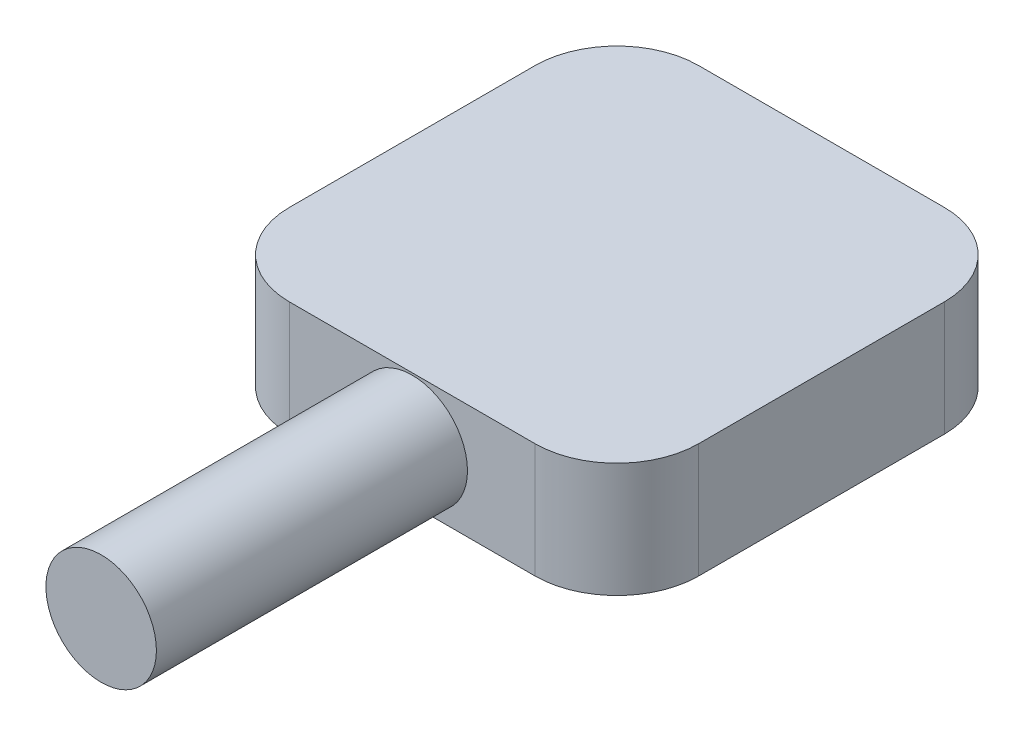
ISO-10303-21;
HEADER;
FILE_DESCRIPTION(('STEP AP214'),'2;1');
FILE_NAME('part.step','',(''),(''),'','','');
FILE_SCHEMA(('AUTOMOTIVE_DESIGN { 1 0 10303 214 1 1 1 1 }'));
ENDSEC;
DATA;
#1=APPLICATION_CONTEXT('core data for automotive mechanical design processes');
#2=APPLICATION_PROTOCOL_DEFINITION('international standard','automotive_design',2000,#1);
#3=PRODUCT_CONTEXT('',#1,'mechanical');
#4=PRODUCT('Part','Part','',(#3));
#5=PRODUCT_RELATED_PRODUCT_CATEGORY('part','',(#4));
#6=PRODUCT_DEFINITION_FORMATION('','',#4);
#7=PRODUCT_DEFINITION_CONTEXT('part definition',#1,'design');
#8=PRODUCT_DEFINITION('design','',#6,#7);
#9=PRODUCT_DEFINITION_SHAPE('','',#8);
#10=(LENGTH_UNIT() NAMED_UNIT(*) SI_UNIT(.MILLI.,.METRE.));
#11=(NAMED_UNIT(*) PLANE_ANGLE_UNIT() SI_UNIT($,.RADIAN.));
#12=(NAMED_UNIT(*) SI_UNIT($,.STERADIAN.) SOLID_ANGLE_UNIT());
#13=UNCERTAINTY_MEASURE_WITH_UNIT(LENGTH_MEASURE(1.E-05),#10,'distance_accuracy_value','');
#14=(GEOMETRIC_REPRESENTATION_CONTEXT(3) GLOBAL_UNCERTAINTY_ASSIGNED_CONTEXT((#13)) GLOBAL_UNIT_ASSIGNED_CONTEXT((#10,
#11,#12)) REPRESENTATION_CONTEXT('',''));
#15=CARTESIAN_POINT('',(0.,0.,0.));
#16=DIRECTION('',(0.,0.,1.));
#17=DIRECTION('',(1.,0.,0.));
#18=AXIS2_PLACEMENT_3D('',#15,#16,#17);
#19=CARTESIAN_POINT('',(0.,0.,-73.));
#20=DIRECTION('',(0.,0.,1.));
#21=DIRECTION('',(1.,0.,0.));
#22=AXIS2_PLACEMENT_3D('',#19,#20,#21);
#23=CYLINDRICAL_SURFACE('',#22,6.75);
#24=CARTESIAN_POINT('',(0.,0.,-28.));
#25=DIRECTION('',(0.,0.,1.));
#26=DIRECTION('',(1.,0.,0.));
#27=AXIS2_PLACEMENT_3D('',#24,#25,#26);
#28=CIRCLE('',#27,6.75);
#29=CARTESIAN_POINT('',(6.75,0.,-28.));
#30=VERTEX_POINT('',#29);
#31=EDGE_CURVE('E11',#30,#30,#28,.F.);
#32=ORIENTED_EDGE('',*,*,#31,.F.);
#33=EDGE_LOOP('',(#32));
#34=FACE_BOUND('',#33,.T.);
#35=CARTESIAN_POINT('',(0.,0.,10.));
#36=DIRECTION('',(0.,0.,1.));
#37=DIRECTION('',(1.,0.,0.));
#38=AXIS2_PLACEMENT_3D('',#35,#36,#37);
#39=CIRCLE('',#38,6.75);
#40=CARTESIAN_POINT('',(6.75,0.,10.));
#41=VERTEX_POINT('',#40);
#42=EDGE_CURVE('E41',#41,#41,#39,.T.);
#43=ORIENTED_EDGE('',*,*,#42,.F.);
#44=EDGE_LOOP('',(#43));
#45=FACE_BOUND('',#44,.T.);
#46=ADVANCED_FACE('F34',(#34,#45),#23,.T.);
#47=CARTESIAN_POINT('',(0.,0.,10.));
#48=DIRECTION('',(0.,0.,1.));
#49=DIRECTION('',(1.,0.,0.));
#50=AXIS2_PLACEMENT_3D('',#47,#48,#49);
#51=PLANE('',#50);
#52=ORIENTED_EDGE('',*,*,#42,.T.);
#53=EDGE_LOOP('',(#52));
#54=FACE_BOUND('',#53,.T.);
#55=ADVANCED_FACE('F167',(#54),#51,.T.);
#56=CARTESIAN_POINT('',(-15.,-7.,-38.));
#57=DIRECTION('',(0.,1.,0.));
#58=DIRECTION('',(0.,0.,1.));
#59=AXIS2_PLACEMENT_3D('',#56,#57,#58);
#60=CYLINDRICAL_SURFACE('',#59,10.);
#61=DIRECTION('',(0.,1.,0.));
#62=VECTOR('',#61,1.);
#63=CARTESIAN_POINT('',(-15.,-7.,-28.));
#64=LINE('',#63,#62);
#65=CARTESIAN_POINT('',(-15.,-7.,-28.));
#66=VERTEX_POINT('',#65);
#67=CARTESIAN_POINT('',(-15.,7.,-28.));
#68=VERTEX_POINT('',#67);
#69=EDGE_CURVE('E97',#66,#68,#64,.T.);
#70=ORIENTED_EDGE('',*,*,#69,.T.);
#71=CARTESIAN_POINT('',(-15.,7.,-38.));
#72=DIRECTION('',(0.,1.,0.));
#73=DIRECTION('',(0.,0.,-1.));
#74=AXIS2_PLACEMENT_3D('',#71,#72,#73);
#75=CIRCLE('',#74,10.);
#76=CARTESIAN_POINT('',(-25.,7.,-38.));
#77=VERTEX_POINT('',#76);
#78=EDGE_CURVE('E101',#77,#68,#75,.T.);
#79=ORIENTED_EDGE('',*,*,#78,.F.);
#80=DIRECTION('',(0.,1.,0.));
#81=VECTOR('',#80,1.);
#82=CARTESIAN_POINT('',(-25.,-7.,-38.));
#83=LINE('',#82,#81);
#84=CARTESIAN_POINT('',(-25.,-7.,-38.));
#85=VERTEX_POINT('',#84);
#86=EDGE_CURVE('E48',#85,#77,#83,.T.);
#87=ORIENTED_EDGE('',*,*,#86,.F.);
#88=CARTESIAN_POINT('',(-15.,-7.,-38.));
#89=DIRECTION('',(0.,1.,0.));
#90=DIRECTION('',(0.,0.,-1.));
#91=AXIS2_PLACEMENT_3D('',#88,#89,#90);
#92=CIRCLE('',#91,10.);
#93=EDGE_CURVE('E102',#85,#66,#92,.T.);
#94=ORIENTED_EDGE('',*,*,#93,.T.);
#95=EDGE_LOOP('',(#70,#79,#87,#94));
#96=FACE_BOUND('',#95,.T.);
#97=ADVANCED_FACE('F99',(#96),#60,.T.);
#98=CARTESIAN_POINT('',(-25.,-7.,-68.));
#99=DIRECTION('',(-1.,0.,0.));
#100=DIRECTION('',(0.,0.,1.));
#101=AXIS2_PLACEMENT_3D('',#98,#99,#100);
#102=PLANE('',#101);
#103=ORIENTED_EDGE('',*,*,#86,.T.);
#104=DIRECTION('',(0.,0.,1.));
#105=VECTOR('',#104,1.);
#106=CARTESIAN_POINT('',(-25.,7.,-68.));
#107=LINE('',#106,#105);
#108=CARTESIAN_POINT('',(-25.,7.,-68.));
#109=VERTEX_POINT('',#108);
#110=EDGE_CURVE('E120',#109,#77,#107,.T.);
#111=ORIENTED_EDGE('',*,*,#110,.F.);
#112=DIRECTION('',(0.,1.,0.));
#113=VECTOR('',#112,1.);
#114=CARTESIAN_POINT('',(-25.,-7.,-68.));
#115=LINE('',#114,#113);
#116=CARTESIAN_POINT('',(-25.,-7.,-68.));
#117=VERTEX_POINT('',#116);
#118=EDGE_CURVE('E56',#117,#109,#115,.T.);
#119=ORIENTED_EDGE('',*,*,#118,.F.);
#120=DIRECTION('',(0.,0.,1.));
#121=VECTOR('',#120,1.);
#122=CARTESIAN_POINT('',(-25.,-7.,-68.));
#123=LINE('',#122,#121);
#124=EDGE_CURVE('E107',#117,#85,#123,.T.);
#125=ORIENTED_EDGE('',*,*,#124,.T.);
#126=EDGE_LOOP('',(#103,#111,#119,#125));
#127=FACE_BOUND('',#126,.T.);
#128=ADVANCED_FACE('F192',(#127),#102,.T.);
#129=CARTESIAN_POINT('',(-15.,-7.,-68.));
#130=DIRECTION('',(0.,1.,0.));
#131=DIRECTION('',(0.,0.,1.));
#132=AXIS2_PLACEMENT_3D('',#129,#130,#131);
#133=CYLINDRICAL_SURFACE('',#132,10.);
#134=ORIENTED_EDGE('',*,*,#118,.T.);
#135=CARTESIAN_POINT('',(-15.,7.,-68.));
#136=DIRECTION('',(0.,1.,0.));
#137=DIRECTION('',(0.,0.,-1.));
#138=AXIS2_PLACEMENT_3D('',#135,#136,#137);
#139=CIRCLE('',#138,10.);
#140=CARTESIAN_POINT('',(-15.,7.,-78.));
#141=VERTEX_POINT('',#140);
#142=EDGE_CURVE('E133',#141,#109,#139,.T.);
#143=ORIENTED_EDGE('',*,*,#142,.F.);
#144=DIRECTION('',(0.,1.,0.));
#145=VECTOR('',#144,1.);
#146=CARTESIAN_POINT('',(-15.,-7.,-78.));
#147=LINE('',#146,#145);
#148=CARTESIAN_POINT('',(-15.,-7.,-78.));
#149=VERTEX_POINT('',#148);
#150=EDGE_CURVE('E156',#149,#141,#147,.T.);
#151=ORIENTED_EDGE('',*,*,#150,.F.);
#152=CARTESIAN_POINT('',(-15.,-7.,-68.));
#153=DIRECTION('',(0.,1.,0.));
#154=DIRECTION('',(0.,0.,-1.));
#155=AXIS2_PLACEMENT_3D('',#152,#153,#154);
#156=CIRCLE('',#155,10.);
#157=EDGE_CURVE('E151',#149,#117,#156,.T.);
#158=ORIENTED_EDGE('',*,*,#157,.T.);
#159=EDGE_LOOP('',(#134,#143,#151,#158));
#160=FACE_BOUND('',#159,.T.);
#161=ADVANCED_FACE('F196',(#160),#133,.T.);
#162=CARTESIAN_POINT('',(15.,-7.,-78.));
#163=DIRECTION('',(0.,0.,-1.));
#164=DIRECTION('',(-1.,0.,0.));
#165=AXIS2_PLACEMENT_3D('',#162,#163,#164);
#166=PLANE('',#165);
#167=ORIENTED_EDGE('',*,*,#150,.T.);
#168=DIRECTION('',(-1.,0.,0.));
#169=VECTOR('',#168,1.);
#170=CARTESIAN_POINT('',(15.,7.,-78.));
#171=LINE('',#170,#169);
#172=CARTESIAN_POINT('',(15.,7.,-78.));
#173=VERTEX_POINT('',#172);
#174=EDGE_CURVE('E130',#173,#141,#171,.T.);
#175=ORIENTED_EDGE('',*,*,#174,.F.);
#176=DIRECTION('',(0.,1.,0.));
#177=VECTOR('',#176,1.);
#178=CARTESIAN_POINT('',(15.,-7.,-78.));
#179=LINE('',#178,#177);
#180=CARTESIAN_POINT('',(15.,-7.,-78.));
#181=VERTEX_POINT('',#180);
#182=EDGE_CURVE('E158',#181,#173,#179,.T.);
#183=ORIENTED_EDGE('',*,*,#182,.F.);
#184=DIRECTION('',(-1.,0.,0.));
#185=VECTOR('',#184,1.);
#186=CARTESIAN_POINT('',(15.,-7.,-78.));
#187=LINE('',#186,#185);
#188=EDGE_CURVE('E148',#181,#149,#187,.T.);
#189=ORIENTED_EDGE('',*,*,#188,.T.);
#190=EDGE_LOOP('',(#167,#175,#183,#189));
#191=FACE_BOUND('',#190,.T.);
#192=ADVANCED_FACE('F201',(#191),#166,.T.);
#193=CARTESIAN_POINT('',(15.,-7.,-68.));
#194=DIRECTION('',(0.,1.,0.));
#195=DIRECTION('',(0.,0.,1.));
#196=AXIS2_PLACEMENT_3D('',#193,#194,#195);
#197=CYLINDRICAL_SURFACE('',#196,10.);
#198=ORIENTED_EDGE('',*,*,#182,.T.);
#199=CARTESIAN_POINT('',(15.,7.,-68.));
#200=DIRECTION('',(0.,1.,0.));
#201=DIRECTION('',(0.,0.,1.));
#202=AXIS2_PLACEMENT_3D('',#199,#200,#201);
#203=CIRCLE('',#202,10.);
#204=CARTESIAN_POINT('',(25.,7.,-68.));
#205=VERTEX_POINT('',#204);
#206=EDGE_CURVE('E127',#205,#173,#203,.T.);
#207=ORIENTED_EDGE('',*,*,#206,.F.);
#208=DIRECTION('',(0.,1.,0.));
#209=VECTOR('',#208,1.);
#210=CARTESIAN_POINT('',(25.,-7.,-68.));
#211=LINE('',#210,#209);
#212=CARTESIAN_POINT('',(25.,-7.,-68.));
#213=VERTEX_POINT('',#212);
#214=EDGE_CURVE('E160',#213,#205,#211,.T.);
#215=ORIENTED_EDGE('',*,*,#214,.F.);
#216=CARTESIAN_POINT('',(15.,-7.,-68.));
#217=DIRECTION('',(0.,1.,0.));
#218=DIRECTION('',(0.,0.,1.));
#219=AXIS2_PLACEMENT_3D('',#216,#217,#218);
#220=CIRCLE('',#219,10.);
#221=EDGE_CURVE('E145',#213,#181,#220,.T.);
#222=ORIENTED_EDGE('',*,*,#221,.T.);
#223=EDGE_LOOP('',(#198,#207,#215,#222));
#224=FACE_BOUND('',#223,.T.);
#225=ADVANCED_FACE('F208',(#224),#197,.T.);
#226=CARTESIAN_POINT('',(25.,-7.,-68.));
#227=DIRECTION('',(1.,0.,0.));
#228=DIRECTION('',(0.,0.,-1.));
#229=AXIS2_PLACEMENT_3D('',#226,#227,#228);
#230=PLANE('',#229);
#231=ORIENTED_EDGE('',*,*,#214,.T.);
#232=DIRECTION('',(0.,0.,-1.));
#233=VECTOR('',#232,1.);
#234=CARTESIAN_POINT('',(25.,7.,-68.));
#235=LINE('',#234,#233);
#236=CARTESIAN_POINT('',(25.,7.,-38.));
#237=VERTEX_POINT('',#236);
#238=EDGE_CURVE('E124',#237,#205,#235,.T.);
#239=ORIENTED_EDGE('',*,*,#238,.F.);
#240=DIRECTION('',(0.,1.,0.));
#241=VECTOR('',#240,1.);
#242=CARTESIAN_POINT('',(25.,-7.,-38.));
#243=LINE('',#242,#241);
#244=CARTESIAN_POINT('',(25.,-7.,-38.));
#245=VERTEX_POINT('',#244);
#246=EDGE_CURVE('E162',#245,#237,#243,.T.);
#247=ORIENTED_EDGE('',*,*,#246,.F.);
#248=DIRECTION('',(0.,0.,-1.));
#249=VECTOR('',#248,1.);
#250=CARTESIAN_POINT('',(25.,-7.,-68.));
#251=LINE('',#250,#249);
#252=EDGE_CURVE('E142',#245,#213,#251,.T.);
#253=ORIENTED_EDGE('',*,*,#252,.T.);
#254=EDGE_LOOP('',(#231,#239,#247,#253));
#255=FACE_BOUND('',#254,.T.);
#256=ADVANCED_FACE('F186',(#255),#230,.T.);
#257=CARTESIAN_POINT('',(15.,-7.,-38.));
#258=DIRECTION('',(0.,1.,0.));
#259=DIRECTION('',(0.,0.,1.));
#260=AXIS2_PLACEMENT_3D('',#257,#258,#259);
#261=CYLINDRICAL_SURFACE('',#260,10.);
#262=ORIENTED_EDGE('',*,*,#246,.T.);
#263=CARTESIAN_POINT('',(15.,7.,-38.));
#264=DIRECTION('',(0.,1.,0.));
#265=DIRECTION('',(0.,0.,-1.));
#266=AXIS2_PLACEMENT_3D('',#263,#264,#265);
#267=CIRCLE('',#266,10.);
#268=CARTESIAN_POINT('',(15.,7.,-28.));
#269=VERTEX_POINT('',#268);
#270=EDGE_CURVE('E115',#269,#237,#267,.T.);
#271=ORIENTED_EDGE('',*,*,#270,.F.);
#272=DIRECTION('',(0.,1.,0.));
#273=VECTOR('',#272,1.);
#274=CARTESIAN_POINT('',(15.,-7.,-28.));
#275=LINE('',#274,#273);
#276=CARTESIAN_POINT('',(15.,-7.,-28.));
#277=VERTEX_POINT('',#276);
#278=EDGE_CURVE('E106',#277,#269,#275,.T.);
#279=ORIENTED_EDGE('',*,*,#278,.F.);
#280=CARTESIAN_POINT('',(15.,-7.,-38.));
#281=DIRECTION('',(0.,1.,0.));
#282=DIRECTION('',(0.,0.,-1.));
#283=AXIS2_PLACEMENT_3D('',#280,#281,#282);
#284=CIRCLE('',#283,10.);
#285=EDGE_CURVE('E139',#277,#245,#284,.T.);
#286=ORIENTED_EDGE('',*,*,#285,.T.);
#287=EDGE_LOOP('',(#262,#271,#279,#286));
#288=FACE_BOUND('',#287,.T.);
#289=ADVANCED_FACE('F178',(#288),#261,.T.);
#290=CARTESIAN_POINT('',(15.,-7.,-28.));
#291=DIRECTION('',(0.,0.,1.));
#292=DIRECTION('',(1.,0.,0.));
#293=AXIS2_PLACEMENT_3D('',#290,#291,#292);
#294=PLANE('',#293);
#295=ORIENTED_EDGE('',*,*,#31,.T.);
#296=EDGE_LOOP('',(#295));
#297=FACE_BOUND('',#296,.T.);
#298=ORIENTED_EDGE('',*,*,#278,.T.);
#299=DIRECTION('',(1.,0.,0.));
#300=VECTOR('',#299,1.);
#301=CARTESIAN_POINT('',(15.,7.,-28.));
#302=LINE('',#301,#300);
#303=EDGE_CURVE('E110',#68,#269,#302,.T.);
#304=ORIENTED_EDGE('',*,*,#303,.F.);
#305=ORIENTED_EDGE('',*,*,#69,.F.);
#306=DIRECTION('',(1.,0.,0.));
#307=VECTOR('',#306,1.);
#308=CARTESIAN_POINT('',(15.,-7.,-28.));
#309=LINE('',#308,#307);
#310=EDGE_CURVE('E137',#66,#277,#309,.T.);
#311=ORIENTED_EDGE('',*,*,#310,.T.);
#312=EDGE_LOOP('',(#298,#304,#305,#311));
#313=FACE_BOUND('',#312,.T.);
#314=ADVANCED_FACE('F111',(#297,#313),#294,.T.);
#315=CARTESIAN_POINT('',(-15.,-7.,-38.));
#316=DIRECTION('',(0.,-1.,0.));
#317=DIRECTION('',(0.,0.,-1.));
#318=AXIS2_PLACEMENT_3D('',#315,#316,#317);
#319=PLANE('',#318);
#320=ORIENTED_EDGE('',*,*,#93,.F.);
#321=ORIENTED_EDGE('',*,*,#124,.F.);
#322=ORIENTED_EDGE('',*,*,#157,.F.);
#323=ORIENTED_EDGE('',*,*,#188,.F.);
#324=ORIENTED_EDGE('',*,*,#221,.F.);
#325=ORIENTED_EDGE('',*,*,#252,.F.);
#326=ORIENTED_EDGE('',*,*,#285,.F.);
#327=ORIENTED_EDGE('',*,*,#310,.F.);
#328=EDGE_LOOP('',(#320,#321,#322,#323,#324,#325,#326,#327));
#329=FACE_BOUND('',#328,.T.);
#330=ADVANCED_FACE('F177',(#329),#319,.T.);
#331=CARTESIAN_POINT('',(-15.,7.,-38.));
#332=DIRECTION('',(0.,-1.,0.));
#333=DIRECTION('',(0.,0.,-1.));
#334=AXIS2_PLACEMENT_3D('',#331,#332,#333);
#335=PLANE('',#334);
#336=ORIENTED_EDGE('',*,*,#78,.T.);
#337=ORIENTED_EDGE('',*,*,#303,.T.);
#338=ORIENTED_EDGE('',*,*,#270,.T.);
#339=ORIENTED_EDGE('',*,*,#238,.T.);
#340=ORIENTED_EDGE('',*,*,#206,.T.);
#341=ORIENTED_EDGE('',*,*,#174,.T.);
#342=ORIENTED_EDGE('',*,*,#142,.T.);
#343=ORIENTED_EDGE('',*,*,#110,.T.);
#344=EDGE_LOOP('',(#336,#337,#338,#339,#340,#341,#342,#343));
#345=FACE_BOUND('',#344,.T.);
#346=ADVANCED_FACE('F118',(#345),#335,.F.);
#347=CLOSED_SHELL('',(#46,#55,#97,#128,#161,#192,#225,#256,#289,#314,#330,#346));
#348=MANIFOLD_SOLID_BREP('B2',#347);
#349=ADVANCED_BREP_SHAPE_REPRESENTATION('',(#18,#348),#14);
#350=SHAPE_DEFINITION_REPRESENTATION(#9,#349);
ENDSEC;
END-ISO-10303-21;
